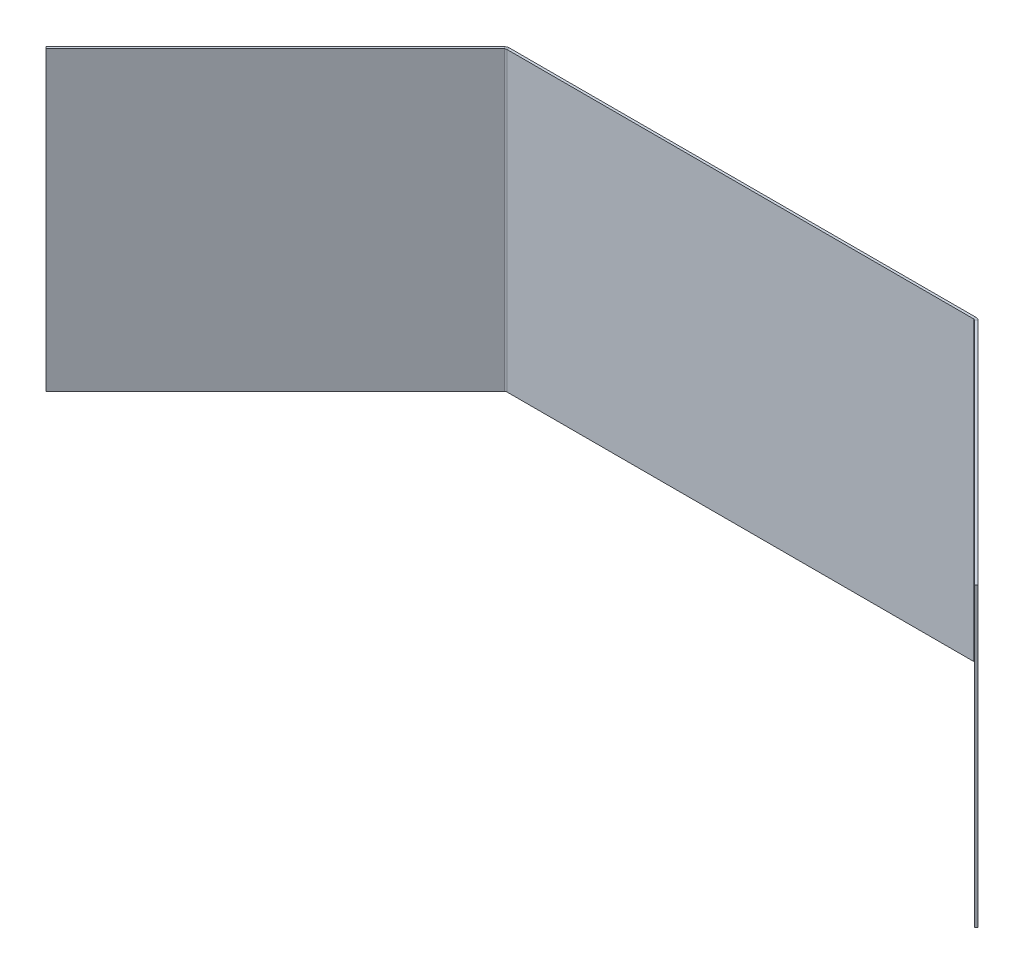
ISO-10303-21;
HEADER;
FILE_DESCRIPTION(('STEP AP214'),'2;1');
FILE_NAME('part.step','',(''),(''),'','','');
FILE_SCHEMA(('AUTOMOTIVE_DESIGN { 1 0 10303 214 1 1 1 1 }'));
ENDSEC;
DATA;
#1=APPLICATION_CONTEXT('core data for automotive mechanical design processes');
#2=APPLICATION_PROTOCOL_DEFINITION('international standard','automotive_design',2000,#1);
#3=PRODUCT_CONTEXT('',#1,'mechanical');
#4=PRODUCT('Part','Part','',(#3));
#5=PRODUCT_RELATED_PRODUCT_CATEGORY('part','',(#4));
#6=PRODUCT_DEFINITION_FORMATION('','',#4);
#7=PRODUCT_DEFINITION_CONTEXT('part definition',#1,'design');
#8=PRODUCT_DEFINITION('design','',#6,#7);
#9=PRODUCT_DEFINITION_SHAPE('','',#8);
#10=(LENGTH_UNIT() NAMED_UNIT(*) SI_UNIT(.MILLI.,.METRE.));
#11=(NAMED_UNIT(*) PLANE_ANGLE_UNIT() SI_UNIT($,.RADIAN.));
#12=(NAMED_UNIT(*) SI_UNIT($,.STERADIAN.) SOLID_ANGLE_UNIT());
#13=UNCERTAINTY_MEASURE_WITH_UNIT(LENGTH_MEASURE(1.E-05),#10,'distance_accuracy_value','');
#14=(GEOMETRIC_REPRESENTATION_CONTEXT(3) GLOBAL_UNCERTAINTY_ASSIGNED_CONTEXT((#13)) GLOBAL_UNIT_ASSIGNED_CONTEXT((#10,
#11,#12)) REPRESENTATION_CONTEXT('',''));
#15=CARTESIAN_POINT('',(0.,0.,0.));
#16=DIRECTION('',(0.,0.,1.));
#17=DIRECTION('',(1.,0.,0.));
#18=AXIS2_PLACEMENT_3D('',#15,#16,#17);
#19=CARTESIAN_POINT('',(-186.210786437627,117.5,0.585786437626912));
#20=DIRECTION('',(0.,1.,0.));
#21=DIRECTION('',(0.,0.,1.));
#22=AXIS2_PLACEMENT_3D('',#19,#20,#21);
#23=PLANE('',#22);
#24=DIRECTION('',(-0.707106781186545,0.,-0.70710678118655));
#25=VECTOR('',#24,1.);
#26=CARTESIAN_POINT('',(-186.210786437627,117.5,0.585786437626912));
#27=LINE('',#26,#25);
#28=CARTESIAN_POINT('',(-186.210786437627,117.5,0.585786437626912));
#29=VERTEX_POINT('',#28);
#30=CARTESIAN_POINT('',(-187.625,117.5,-0.828427124746206));
#31=VERTEX_POINT('',#30);
#32=EDGE_CURVE('E12',#29,#31,#27,.T.);
#33=ORIENTED_EDGE('',*,*,#32,.F.);
#34=CARTESIAN_POINT('',(-184.796572875254,117.5,2.));
#35=DIRECTION('',(0.,1.,0.));
#36=DIRECTION('',(0.,0.,1.));
#37=AXIS2_PLACEMENT_3D('',#34,#35,#36);
#38=CIRCLE('',#37,2.);
#39=CARTESIAN_POINT('',(-184.796572875254,117.5,0.));
#40=VERTEX_POINT('',#39);
#41=EDGE_CURVE('E184',#29,#40,#38,.F.);
#42=ORIENTED_EDGE('',*,*,#41,.T.);
#43=DIRECTION('',(0.,0.,1.));
#44=VECTOR('',#43,1.);
#45=CARTESIAN_POINT('',(-184.796572875254,117.5,-2.));
#46=LINE('',#45,#44);
#47=CARTESIAN_POINT('',(-184.796572875254,117.5,-2.));
#48=VERTEX_POINT('',#47);
#49=EDGE_CURVE('E82',#48,#40,#46,.T.);
#50=ORIENTED_EDGE('',*,*,#49,.F.);
#51=CARTESIAN_POINT('',(-184.796572875254,117.5,2.));
#52=DIRECTION('',(0.,1.,0.));
#53=DIRECTION('',(1.,0.,0.));
#54=AXIS2_PLACEMENT_3D('',#51,#52,#53);
#55=CIRCLE('',#54,4.);
#56=EDGE_CURVE('E278',#31,#48,#55,.F.);
#57=ORIENTED_EDGE('',*,*,#56,.F.);
#58=EDGE_LOOP('',(#33,#42,#50,#57));
#59=FACE_BOUND('',#58,.T.);
#60=ADVANCED_FACE('F74',(#59),#23,.T.);
#61=CARTESIAN_POINT('',(-184.796572875254,117.5,-2.));
#62=DIRECTION('',(0.,1.,0.));
#63=DIRECTION('',(0.,0.,1.));
#64=AXIS2_PLACEMENT_3D('',#61,#62,#63);
#65=PLANE('',#64);
#66=DIRECTION('',(0.707106781186551,0.,-0.707106781186544));
#67=VECTOR('',#66,1.);
#68=CARTESIAN_POINT('',(-185.625,117.5,0.));
#69=LINE('',#68,#67);
#70=CARTESIAN_POINT('',(-367.697925087725,117.5,182.072925087723));
#71=VERTEX_POINT('',#70);
#72=EDGE_CURVE('E189',#71,#29,#69,.T.);
#73=ORIENTED_EDGE('',*,*,#72,.T.);
#74=ORIENTED_EDGE('',*,*,#32,.T.);
#75=DIRECTION('',(0.707106781186551,0.,-0.707106781186544));
#76=VECTOR('',#75,1.);
#77=CARTESIAN_POINT('',(-187.039213562373,117.5,-1.41421356237309));
#78=LINE('',#77,#76);
#79=CARTESIAN_POINT('',(-369.112138650098,117.5,180.65871152535));
#80=VERTEX_POINT('',#79);
#81=EDGE_CURVE('E291',#80,#31,#78,.T.);
#82=ORIENTED_EDGE('',*,*,#81,.F.);
#83=DIRECTION('',(-0.707106781186568,0.,-0.707106781186527));
#84=VECTOR('',#83,1.);
#85=CARTESIAN_POINT('',(-367.697925087725,117.5,182.072925087723));
#86=LINE('',#85,#84);
#87=EDGE_CURVE('E293',#71,#80,#86,.T.);
#88=ORIENTED_EDGE('',*,*,#87,.F.);
#89=EDGE_LOOP('',(#73,#74,#82,#88));
#90=FACE_BOUND('',#89,.T.);
#91=ADVANCED_FACE('F304',(#90),#65,.T.);
#92=CARTESIAN_POINT('',(-184.796572875254,-117.5,0.));
#93=DIRECTION('',(0.,-1.,0.));
#94=DIRECTION('',(0.,0.,-1.));
#95=AXIS2_PLACEMENT_3D('',#92,#93,#94);
#96=PLANE('',#95);
#97=DIRECTION('',(0.,0.,-1.));
#98=VECTOR('',#97,1.);
#99=CARTESIAN_POINT('',(-184.796572875254,-117.5,0.));
#100=LINE('',#99,#98);
#101=CARTESIAN_POINT('',(-184.796572875254,-117.5,0.));
#102=VERTEX_POINT('',#101);
#103=CARTESIAN_POINT('',(-184.796572875254,-117.5,-2.));
#104=VERTEX_POINT('',#103);
#105=EDGE_CURVE('E182',#102,#104,#100,.T.);
#106=ORIENTED_EDGE('',*,*,#105,.F.);
#107=CARTESIAN_POINT('',(-184.796572875254,-117.5,2.));
#108=DIRECTION('',(0.,1.,0.));
#109=DIRECTION('',(0.,0.,1.));
#110=AXIS2_PLACEMENT_3D('',#107,#108,#109);
#111=CIRCLE('',#110,2.);
#112=CARTESIAN_POINT('',(-186.210786437627,-117.5,0.585786437626912));
#113=VERTEX_POINT('',#112);
#114=EDGE_CURVE('E196',#113,#102,#111,.F.);
#115=ORIENTED_EDGE('',*,*,#114,.F.);
#116=DIRECTION('',(0.707106781186545,0.,0.70710678118655));
#117=VECTOR('',#116,1.);
#118=CARTESIAN_POINT('',(-187.625,-117.5,-0.828427124746206));
#119=LINE('',#118,#117);
#120=CARTESIAN_POINT('',(-187.625,-117.5,-0.828427124746206));
#121=VERTEX_POINT('',#120);
#122=EDGE_CURVE('E269',#121,#113,#119,.T.);
#123=ORIENTED_EDGE('',*,*,#122,.F.);
#124=CARTESIAN_POINT('',(-184.796572875254,-117.5,2.));
#125=DIRECTION('',(0.,1.,0.));
#126=DIRECTION('',(1.,0.,0.));
#127=AXIS2_PLACEMENT_3D('',#124,#125,#126);
#128=CIRCLE('',#127,4.);
#129=EDGE_CURVE('E223',#121,#104,#128,.F.);
#130=ORIENTED_EDGE('',*,*,#129,.T.);
#131=EDGE_LOOP('',(#106,#115,#123,#130));
#132=FACE_BOUND('',#131,.T.);
#133=ADVANCED_FACE('F283',(#132),#96,.T.);
#134=CARTESIAN_POINT('',(-187.625,-117.5,-0.828427124746206));
#135=DIRECTION('',(0.,-1.,0.));
#136=DIRECTION('',(0.,0.,-1.));
#137=AXIS2_PLACEMENT_3D('',#134,#135,#136);
#138=PLANE('',#137);
#139=DIRECTION('',(1.,0.,0.));
#140=VECTOR('',#139,1.);
#141=CARTESIAN_POINT('',(-185.625,-117.5,0.));
#142=LINE('',#141,#140);
#143=CARTESIAN_POINT('',(184.796572875254,-117.5,0.));
#144=VERTEX_POINT('',#143);
#145=EDGE_CURVE('E236',#102,#144,#142,.T.);
#146=ORIENTED_EDGE('',*,*,#145,.F.);
#147=ORIENTED_EDGE('',*,*,#105,.T.);
#148=DIRECTION('',(1.,0.,0.));
#149=VECTOR('',#148,1.);
#150=CARTESIAN_POINT('',(-185.625,-117.5,-2.));
#151=LINE('',#150,#149);
#152=CARTESIAN_POINT('',(184.796572875254,-117.5,-2.));
#153=VERTEX_POINT('',#152);
#154=EDGE_CURVE('E221',#104,#153,#151,.T.);
#155=ORIENTED_EDGE('',*,*,#154,.T.);
#156=DIRECTION('',(0.,0.,1.));
#157=VECTOR('',#156,1.);
#158=CARTESIAN_POINT('',(184.796572875254,-117.5,-2.));
#159=LINE('',#158,#157);
#160=EDGE_CURVE('E131',#153,#144,#159,.T.);
#161=ORIENTED_EDGE('',*,*,#160,.T.);
#162=EDGE_LOOP('',(#146,#147,#155,#161));
#163=FACE_BOUND('',#162,.T.);
#164=ADVANCED_FACE('F271',(#163),#138,.T.);
#165=CARTESIAN_POINT('',(184.796572875254,117.5,0.));
#166=DIRECTION('',(0.,1.,0.));
#167=DIRECTION('',(0.,0.,1.));
#168=AXIS2_PLACEMENT_3D('',#165,#166,#167);
#169=PLANE('',#168);
#170=DIRECTION('',(0.,0.,-1.));
#171=VECTOR('',#170,1.);
#172=CARTESIAN_POINT('',(184.796572875254,117.5,0.));
#173=LINE('',#172,#171);
#174=CARTESIAN_POINT('',(184.796572875254,117.5,0.));
#175=VERTEX_POINT('',#174);
#176=CARTESIAN_POINT('',(184.796572875254,117.5,-2.));
#177=VERTEX_POINT('',#176);
#178=EDGE_CURVE('E267',#175,#177,#173,.T.);
#179=ORIENTED_EDGE('',*,*,#178,.F.);
#180=CARTESIAN_POINT('',(184.796572875254,117.5,2.));
#181=DIRECTION('',(0.,1.,0.));
#182=DIRECTION('',(0.,0.,1.));
#183=AXIS2_PLACEMENT_3D('',#180,#181,#182);
#184=CIRCLE('',#183,2.);
#185=CARTESIAN_POINT('',(186.210786437627,117.5,0.585786437626912));
#186=VERTEX_POINT('',#185);
#187=EDGE_CURVE('E204',#175,#186,#184,.F.);
#188=ORIENTED_EDGE('',*,*,#187,.T.);
#189=DIRECTION('',(-0.707106781186545,0.,0.70710678118655));
#190=VECTOR('',#189,1.);
#191=CARTESIAN_POINT('',(187.625,117.5,-0.828427124746206));
#192=LINE('',#191,#190);
#193=CARTESIAN_POINT('',(187.625,117.5,-0.828427124746206));
#194=VERTEX_POINT('',#193);
#195=EDGE_CURVE('E90',#194,#186,#192,.T.);
#196=ORIENTED_EDGE('',*,*,#195,.F.);
#197=CARTESIAN_POINT('',(184.796572875254,117.5,2.));
#198=DIRECTION('',(0.,1.,0.));
#199=DIRECTION('',(1.,0.,0.));
#200=AXIS2_PLACEMENT_3D('',#197,#198,#199);
#201=CIRCLE('',#200,4.);
#202=EDGE_CURVE('E295',#177,#194,#201,.F.);
#203=ORIENTED_EDGE('',*,*,#202,.F.);
#204=EDGE_LOOP('',(#179,#188,#196,#203));
#205=FACE_BOUND('',#204,.T.);
#206=ADVANCED_FACE('F330',(#205),#169,.T.);
#207=CARTESIAN_POINT('',(187.625,117.5,-0.828427124746206));
#208=DIRECTION('',(0.,1.,0.));
#209=DIRECTION('',(0.,0.,1.));
#210=AXIS2_PLACEMENT_3D('',#207,#208,#209);
#211=PLANE('',#210);
#212=DIRECTION('',(1.,0.,0.));
#213=VECTOR('',#212,1.);
#214=CARTESIAN_POINT('',(-185.625,117.5,0.));
#215=LINE('',#214,#213);
#216=EDGE_CURVE('E174',#40,#175,#215,.T.);
#217=ORIENTED_EDGE('',*,*,#216,.T.);
#218=ORIENTED_EDGE('',*,*,#178,.T.);
#219=DIRECTION('',(1.,0.,0.));
#220=VECTOR('',#219,1.);
#221=CARTESIAN_POINT('',(-185.625,117.5,-2.));
#222=LINE('',#221,#220);
#223=EDGE_CURVE('E177',#48,#177,#222,.T.);
#224=ORIENTED_EDGE('',*,*,#223,.F.);
#225=ORIENTED_EDGE('',*,*,#49,.T.);
#226=EDGE_LOOP('',(#217,#218,#224,#225));
#227=FACE_BOUND('',#226,.T.);
#228=ADVANCED_FACE('F172',(#227),#211,.T.);
#229=CARTESIAN_POINT('',(186.210786437627,-117.5,0.585786437626912));
#230=DIRECTION('',(0.,-1.,0.));
#231=DIRECTION('',(0.,0.,-1.));
#232=AXIS2_PLACEMENT_3D('',#229,#230,#231);
#233=PLANE('',#232);
#234=DIRECTION('',(0.707106781186545,0.,-0.70710678118655));
#235=VECTOR('',#234,1.);
#236=CARTESIAN_POINT('',(186.210786437627,-117.5,0.585786437626912));
#237=LINE('',#236,#235);
#238=CARTESIAN_POINT('',(186.210786437627,-117.5,0.585786437626912));
#239=VERTEX_POINT('',#238);
#240=CARTESIAN_POINT('',(187.625,-117.5,-0.828427124746206));
#241=VERTEX_POINT('',#240);
#242=EDGE_CURVE('E138',#239,#241,#237,.T.);
#243=ORIENTED_EDGE('',*,*,#242,.F.);
#244=CARTESIAN_POINT('',(184.796572875254,-117.5,2.));
#245=DIRECTION('',(0.,1.,0.));
#246=DIRECTION('',(0.,0.,1.));
#247=AXIS2_PLACEMENT_3D('',#244,#245,#246);
#248=CIRCLE('',#247,2.);
#249=EDGE_CURVE('E238',#144,#239,#248,.F.);
#250=ORIENTED_EDGE('',*,*,#249,.F.);
#251=ORIENTED_EDGE('',*,*,#160,.F.);
#252=CARTESIAN_POINT('',(184.796572875254,-117.5,2.));
#253=DIRECTION('',(0.,1.,0.));
#254=DIRECTION('',(1.,0.,0.));
#255=AXIS2_PLACEMENT_3D('',#252,#253,#254);
#256=CIRCLE('',#255,4.);
#257=EDGE_CURVE('E219',#153,#241,#256,.F.);
#258=ORIENTED_EDGE('',*,*,#257,.T.);
#259=EDGE_LOOP('',(#243,#250,#251,#258));
#260=FACE_BOUND('',#259,.T.);
#261=ADVANCED_FACE('F336',(#260),#233,.T.);
#262=CARTESIAN_POINT('',(184.796572875254,-117.5,-2.));
#263=DIRECTION('',(0.,-1.,0.));
#264=DIRECTION('',(0.,0.,-1.));
#265=AXIS2_PLACEMENT_3D('',#262,#263,#264);
#266=PLANE('',#265);
#267=DIRECTION('',(0.707106781186551,0.,0.707106781186544));
#268=VECTOR('',#267,1.);
#269=CARTESIAN_POINT('',(185.625,-117.5,0.));
#270=LINE('',#269,#268);
#271=CARTESIAN_POINT('',(367.697925087725,-117.5,182.072925087723));
#272=VERTEX_POINT('',#271);
#273=EDGE_CURVE('E210',#239,#272,#270,.T.);
#274=ORIENTED_EDGE('',*,*,#273,.F.);
#275=ORIENTED_EDGE('',*,*,#242,.T.);
#276=DIRECTION('',(0.707106781186551,0.,0.707106781186544));
#277=VECTOR('',#276,1.);
#278=CARTESIAN_POINT('',(187.039213562373,-117.5,-1.41421356237309));
#279=LINE('',#278,#277);
#280=CARTESIAN_POINT('',(369.112138650098,-117.5,180.65871152535));
#281=VERTEX_POINT('',#280);
#282=EDGE_CURVE('E216',#241,#281,#279,.T.);
#283=ORIENTED_EDGE('',*,*,#282,.T.);
#284=DIRECTION('',(-0.707106781186568,0.,0.707106781186527));
#285=VECTOR('',#284,1.);
#286=CARTESIAN_POINT('',(369.112138650098,-117.5,180.65871152535));
#287=LINE('',#286,#285);
#288=EDGE_CURVE('E213',#281,#272,#287,.T.);
#289=ORIENTED_EDGE('',*,*,#288,.T.);
#290=EDGE_LOOP('',(#274,#275,#283,#289));
#291=FACE_BOUND('',#290,.T.);
#292=ADVANCED_FACE('F339',(#291),#266,.T.);
#293=CARTESIAN_POINT('',(185.625,117.5,0.));
#294=DIRECTION('',(0.707106781186544,0.,-0.707106781186551));
#295=DIRECTION('',(-0.707106781186551,0.,-0.707106781186544));
#296=AXIS2_PLACEMENT_3D('',#293,#294,#295);
#297=PLANE('',#296);
#298=ORIENTED_EDGE('',*,*,#273,.T.);
#299=DIRECTION('',(0.,-1.,0.));
#300=VECTOR('',#299,1.);
#301=CARTESIAN_POINT('',(367.697925087725,117.5,182.072925087723));
#302=LINE('',#301,#300);
#303=CARTESIAN_POINT('',(367.697925087725,117.5,182.072925087723));
#304=VERTEX_POINT('',#303);
#305=EDGE_CURVE('E262',#304,#272,#302,.T.);
#306=ORIENTED_EDGE('',*,*,#305,.F.);
#307=DIRECTION('',(0.707106781186551,0.,0.707106781186544));
#308=VECTOR('',#307,1.);
#309=CARTESIAN_POINT('',(185.625,117.5,0.));
#310=LINE('',#309,#308);
#311=EDGE_CURVE('E144',#186,#304,#310,.T.);
#312=ORIENTED_EDGE('',*,*,#311,.F.);
#313=DIRECTION('',(0.,-1.,0.));
#314=VECTOR('',#313,1.);
#315=CARTESIAN_POINT('',(186.210786437627,117.5,0.585786437626912));
#316=LINE('',#315,#314);
#317=EDGE_CURVE('E206',#186,#239,#316,.T.);
#318=ORIENTED_EDGE('',*,*,#317,.T.);
#319=EDGE_LOOP('',(#298,#306,#312,#318));
#320=FACE_BOUND('',#319,.T.);
#321=ADVANCED_FACE('F342',(#320),#297,.F.);
#322=CARTESIAN_POINT('',(369.112138650098,117.5,180.65871152535));
#323=DIRECTION('',(0.707106781186527,0.,0.707106781186568));
#324=DIRECTION('',(0.707106781186568,0.,-0.707106781186527));
#325=AXIS2_PLACEMENT_3D('',#322,#323,#324);
#326=PLANE('',#325);
#327=ORIENTED_EDGE('',*,*,#288,.F.);
#328=DIRECTION('',(0.,-1.,0.));
#329=VECTOR('',#328,1.);
#330=CARTESIAN_POINT('',(369.112138650098,117.5,180.65871152535));
#331=LINE('',#330,#329);
#332=CARTESIAN_POINT('',(369.112138650098,117.5,180.65871152535));
#333=VERTEX_POINT('',#332);
#334=EDGE_CURVE('E260',#333,#281,#331,.T.);
#335=ORIENTED_EDGE('',*,*,#334,.F.);
#336=DIRECTION('',(-0.707106781186568,0.,0.707106781186527));
#337=VECTOR('',#336,1.);
#338=CARTESIAN_POINT('',(369.112138650098,117.5,180.65871152535));
#339=LINE('',#338,#337);
#340=EDGE_CURVE('E550',#333,#304,#339,.T.);
#341=ORIENTED_EDGE('',*,*,#340,.T.);
#342=ORIENTED_EDGE('',*,*,#305,.T.);
#343=EDGE_LOOP('',(#327,#335,#341,#342));
#344=FACE_BOUND('',#343,.T.);
#345=ADVANCED_FACE('F346',(#344),#326,.T.);
#346=CARTESIAN_POINT('',(187.039213562373,117.5,-1.41421356237309));
#347=DIRECTION('',(0.707106781186544,0.,-0.707106781186551));
#348=DIRECTION('',(-0.707106781186551,0.,-0.707106781186544));
#349=AXIS2_PLACEMENT_3D('',#346,#347,#348);
#350=PLANE('',#349);
#351=ORIENTED_EDGE('',*,*,#282,.F.);
#352=DIRECTION('',(0.,-1.,0.));
#353=VECTOR('',#352,1.);
#354=CARTESIAN_POINT('',(187.625,117.5,-0.828427124746206));
#355=LINE('',#354,#353);
#356=EDGE_CURVE('E257',#194,#241,#355,.T.);
#357=ORIENTED_EDGE('',*,*,#356,.F.);
#358=DIRECTION('',(0.707106781186551,0.,0.707106781186544));
#359=VECTOR('',#358,1.);
#360=CARTESIAN_POINT('',(187.039213562373,117.5,-1.41421356237309));
#361=LINE('',#360,#359);
#362=EDGE_CURVE('E552',#194,#333,#361,.T.);
#363=ORIENTED_EDGE('',*,*,#362,.T.);
#364=ORIENTED_EDGE('',*,*,#334,.T.);
#365=EDGE_LOOP('',(#351,#357,#363,#364));
#366=FACE_BOUND('',#365,.T.);
#367=ADVANCED_FACE('F350',(#366),#350,.T.);
#368=CARTESIAN_POINT('',(184.796572875254,117.5,2.));
#369=DIRECTION('',(0.,-1.,0.));
#370=DIRECTION('',(0.,0.,-1.));
#371=AXIS2_PLACEMENT_3D('',#368,#369,#370);
#372=CYLINDRICAL_SURFACE('',#371,4.);
#373=ORIENTED_EDGE('',*,*,#257,.F.);
#374=DIRECTION('',(0.,-1.,0.));
#375=VECTOR('',#374,1.);
#376=CARTESIAN_POINT('',(184.796572875254,117.5,-2.));
#377=LINE('',#376,#375);
#378=EDGE_CURVE('E254',#177,#153,#377,.T.);
#379=ORIENTED_EDGE('',*,*,#378,.F.);
#380=ORIENTED_EDGE('',*,*,#202,.T.);
#381=ORIENTED_EDGE('',*,*,#356,.T.);
#382=EDGE_LOOP('',(#373,#379,#380,#381));
#383=FACE_BOUND('',#382,.T.);
#384=ADVANCED_FACE('F354',(#383),#372,.T.);
#385=CARTESIAN_POINT('',(-185.625,117.5,-2.));
#386=DIRECTION('',(0.,0.,-1.));
#387=DIRECTION('',(-1.,0.,0.));
#388=AXIS2_PLACEMENT_3D('',#385,#386,#387);
#389=PLANE('',#388);
#390=ORIENTED_EDGE('',*,*,#154,.F.);
#391=DIRECTION('',(0.,-1.,0.));
#392=VECTOR('',#391,1.);
#393=CARTESIAN_POINT('',(-184.796572875254,117.5,-2.));
#394=LINE('',#393,#392);
#395=EDGE_CURVE('E251',#48,#104,#394,.T.);
#396=ORIENTED_EDGE('',*,*,#395,.F.);
#397=ORIENTED_EDGE('',*,*,#223,.T.);
#398=ORIENTED_EDGE('',*,*,#378,.T.);
#399=EDGE_LOOP('',(#390,#396,#397,#398));
#400=FACE_BOUND('',#399,.T.);
#401=ADVANCED_FACE('F280',(#400),#389,.T.);
#402=CARTESIAN_POINT('',(-184.796572875254,117.5,2.));
#403=DIRECTION('',(0.,-1.,0.));
#404=DIRECTION('',(0.,0.,-1.));
#405=AXIS2_PLACEMENT_3D('',#402,#403,#404);
#406=CYLINDRICAL_SURFACE('',#405,4.);
#407=ORIENTED_EDGE('',*,*,#129,.F.);
#408=DIRECTION('',(0.,-1.,0.));
#409=VECTOR('',#408,1.);
#410=CARTESIAN_POINT('',(-187.625,117.5,-0.828427124746206));
#411=LINE('',#410,#409);
#412=EDGE_CURVE('E248',#31,#121,#411,.T.);
#413=ORIENTED_EDGE('',*,*,#412,.F.);
#414=ORIENTED_EDGE('',*,*,#56,.T.);
#415=ORIENTED_EDGE('',*,*,#395,.T.);
#416=EDGE_LOOP('',(#407,#413,#414,#415));
#417=FACE_BOUND('',#416,.T.);
#418=ADVANCED_FACE('F276',(#417),#406,.T.);
#419=CARTESIAN_POINT('',(-187.039213562373,117.5,-1.41421356237309));
#420=DIRECTION('',(-0.707106781186544,0.,-0.707106781186551));
#421=DIRECTION('',(-0.707106781186551,0.,0.707106781186544));
#422=AXIS2_PLACEMENT_3D('',#419,#420,#421);
#423=PLANE('',#422);
#424=DIRECTION('',(0.707106781186551,0.,-0.707106781186544));
#425=VECTOR('',#424,1.);
#426=CARTESIAN_POINT('',(-187.039213562373,-117.5,-1.41421356237309));
#427=LINE('',#426,#425);
#428=CARTESIAN_POINT('',(-369.112138650098,-117.5,180.65871152535));
#429=VERTEX_POINT('',#428);
#430=EDGE_CURVE('E226',#429,#121,#427,.T.);
#431=ORIENTED_EDGE('',*,*,#430,.F.);
#432=DIRECTION('',(0.,-1.,0.));
#433=VECTOR('',#432,1.);
#434=CARTESIAN_POINT('',(-369.112138650098,117.5,180.65871152535));
#435=LINE('',#434,#433);
#436=EDGE_CURVE('E246',#80,#429,#435,.T.);
#437=ORIENTED_EDGE('',*,*,#436,.F.);
#438=ORIENTED_EDGE('',*,*,#81,.T.);
#439=ORIENTED_EDGE('',*,*,#412,.T.);
#440=EDGE_LOOP('',(#431,#437,#438,#439));
#441=FACE_BOUND('',#440,.T.);
#442=ADVANCED_FACE('F289',(#441),#423,.T.);
#443=CARTESIAN_POINT('',(-367.697925087725,117.5,182.072925087723));
#444=DIRECTION('',(-0.707106781186527,0.,0.707106781186568));
#445=DIRECTION('',(0.707106781186568,0.,0.707106781186527));
#446=AXIS2_PLACEMENT_3D('',#443,#444,#445);
#447=PLANE('',#446);
#448=DIRECTION('',(-0.707106781186568,0.,-0.707106781186527));
#449=VECTOR('',#448,1.);
#450=CARTESIAN_POINT('',(-367.697925087725,-117.5,182.072925087723));
#451=LINE('',#450,#449);
#452=CARTESIAN_POINT('',(-367.697925087725,-117.5,182.072925087723));
#453=VERTEX_POINT('',#452);
#454=EDGE_CURVE('E229',#453,#429,#451,.T.);
#455=ORIENTED_EDGE('',*,*,#454,.F.);
#456=DIRECTION('',(0.,-1.,0.));
#457=VECTOR('',#456,1.);
#458=CARTESIAN_POINT('',(-367.697925087725,117.5,182.072925087723));
#459=LINE('',#458,#457);
#460=EDGE_CURVE('E244',#71,#453,#459,.T.);
#461=ORIENTED_EDGE('',*,*,#460,.F.);
#462=ORIENTED_EDGE('',*,*,#87,.T.);
#463=ORIENTED_EDGE('',*,*,#436,.T.);
#464=EDGE_LOOP('',(#455,#461,#462,#463));
#465=FACE_BOUND('',#464,.T.);
#466=ADVANCED_FACE('F310',(#465),#447,.T.);
#467=CARTESIAN_POINT('',(-185.625,117.5,0.));
#468=DIRECTION('',(-0.707106781186544,0.,-0.707106781186551));
#469=DIRECTION('',(-0.707106781186551,0.,0.707106781186544));
#470=AXIS2_PLACEMENT_3D('',#467,#468,#469);
#471=PLANE('',#470);
#472=DIRECTION('',(0.707106781186551,0.,-0.707106781186544));
#473=VECTOR('',#472,1.);
#474=CARTESIAN_POINT('',(-185.625,-117.5,0.));
#475=LINE('',#474,#473);
#476=EDGE_CURVE('E232',#453,#113,#475,.T.);
#477=ORIENTED_EDGE('',*,*,#476,.T.);
#478=DIRECTION('',(0.,-1.,0.));
#479=VECTOR('',#478,1.);
#480=CARTESIAN_POINT('',(-186.210786437627,117.5,0.585786437626912));
#481=LINE('',#480,#479);
#482=EDGE_CURVE('E198',#29,#113,#481,.T.);
#483=ORIENTED_EDGE('',*,*,#482,.F.);
#484=ORIENTED_EDGE('',*,*,#72,.F.);
#485=ORIENTED_EDGE('',*,*,#460,.T.);
#486=EDGE_LOOP('',(#477,#483,#484,#485));
#487=FACE_BOUND('',#486,.T.);
#488=ADVANCED_FACE('F306',(#487),#471,.F.);
#489=CARTESIAN_POINT('',(-184.796572875254,117.5,2.));
#490=DIRECTION('',(0.,-1.,0.));
#491=DIRECTION('',(0.,0.,-1.));
#492=AXIS2_PLACEMENT_3D('',#489,#490,#491);
#493=CYLINDRICAL_SURFACE('',#492,2.);
#494=ORIENTED_EDGE('',*,*,#114,.T.);
#495=DIRECTION('',(0.,-1.,0.));
#496=VECTOR('',#495,1.);
#497=CARTESIAN_POINT('',(-184.796572875254,117.5,0.));
#498=LINE('',#497,#496);
#499=EDGE_CURVE('E193',#40,#102,#498,.T.);
#500=ORIENTED_EDGE('',*,*,#499,.F.);
#501=ORIENTED_EDGE('',*,*,#41,.F.);
#502=ORIENTED_EDGE('',*,*,#482,.T.);
#503=EDGE_LOOP('',(#494,#500,#501,#502));
#504=FACE_BOUND('',#503,.T.);
#505=ADVANCED_FACE('F194',(#504),#493,.F.);
#506=CARTESIAN_POINT('',(-185.625,117.5,0.));
#507=DIRECTION('',(0.,0.,-1.));
#508=DIRECTION('',(-1.,0.,0.));
#509=AXIS2_PLACEMENT_3D('',#506,#507,#508);
#510=PLANE('',#509);
#511=ORIENTED_EDGE('',*,*,#145,.T.);
#512=DIRECTION('',(0.,-1.,0.));
#513=VECTOR('',#512,1.);
#514=CARTESIAN_POINT('',(184.796572875254,117.5,0.));
#515=LINE('',#514,#513);
#516=EDGE_CURVE('E199',#175,#144,#515,.T.);
#517=ORIENTED_EDGE('',*,*,#516,.F.);
#518=ORIENTED_EDGE('',*,*,#216,.F.);
#519=ORIENTED_EDGE('',*,*,#499,.T.);
#520=EDGE_LOOP('',(#511,#517,#518,#519));
#521=FACE_BOUND('',#520,.T.);
#522=ADVANCED_FACE('F201',(#521),#510,.F.);
#523=CARTESIAN_POINT('',(184.796572875254,117.5,2.));
#524=DIRECTION('',(0.,-1.,0.));
#525=DIRECTION('',(0.,0.,-1.));
#526=AXIS2_PLACEMENT_3D('',#523,#524,#525);
#527=CYLINDRICAL_SURFACE('',#526,2.);
#528=ORIENTED_EDGE('',*,*,#249,.T.);
#529=ORIENTED_EDGE('',*,*,#317,.F.);
#530=ORIENTED_EDGE('',*,*,#187,.F.);
#531=ORIENTED_EDGE('',*,*,#516,.T.);
#532=EDGE_LOOP('',(#528,#529,#530,#531));
#533=FACE_BOUND('',#532,.T.);
#534=ADVANCED_FACE('F401',(#533),#527,.F.);
#535=CARTESIAN_POINT('',(184.796572875254,117.5,2.));
#536=DIRECTION('',(0.,1.,0.));
#537=DIRECTION('',(1.,0.,0.));
#538=AXIS2_PLACEMENT_3D('',#535,#536,#537);
#539=PLANE('',#538);
#540=ORIENTED_EDGE('',*,*,#311,.T.);
#541=ORIENTED_EDGE('',*,*,#340,.F.);
#542=ORIENTED_EDGE('',*,*,#362,.F.);
#543=ORIENTED_EDGE('',*,*,#195,.T.);
#544=EDGE_LOOP('',(#540,#541,#542,#543));
#545=FACE_BOUND('',#544,.T.);
#546=ADVANCED_FACE('F411',(#545),#539,.T.);
#547=CARTESIAN_POINT('',(184.796572875254,-117.5,2.));
#548=DIRECTION('',(0.,1.,0.));
#549=DIRECTION('',(1.,0.,0.));
#550=AXIS2_PLACEMENT_3D('',#547,#548,#549);
#551=PLANE('',#550);
#552=ORIENTED_EDGE('',*,*,#430,.T.);
#553=ORIENTED_EDGE('',*,*,#122,.T.);
#554=ORIENTED_EDGE('',*,*,#476,.F.);
#555=ORIENTED_EDGE('',*,*,#454,.T.);
#556=EDGE_LOOP('',(#552,#553,#554,#555));
#557=FACE_BOUND('',#556,.T.);
#558=ADVANCED_FACE('F308',(#557),#551,.F.);
#559=CLOSED_SHELL('',(#60,#91,#133,#164,#206,#228,#261,#292,#321,#345,#367,#384,#401,#418,#442,
#466,#488,#505,#522,#534,#546,#558));
#560=MANIFOLD_SOLID_BREP('B2',#559);
#561=ADVANCED_BREP_SHAPE_REPRESENTATION('',(#18,#560),#14);
#562=SHAPE_DEFINITION_REPRESENTATION(#9,#561);
ENDSEC;
END-ISO-10303-21;
